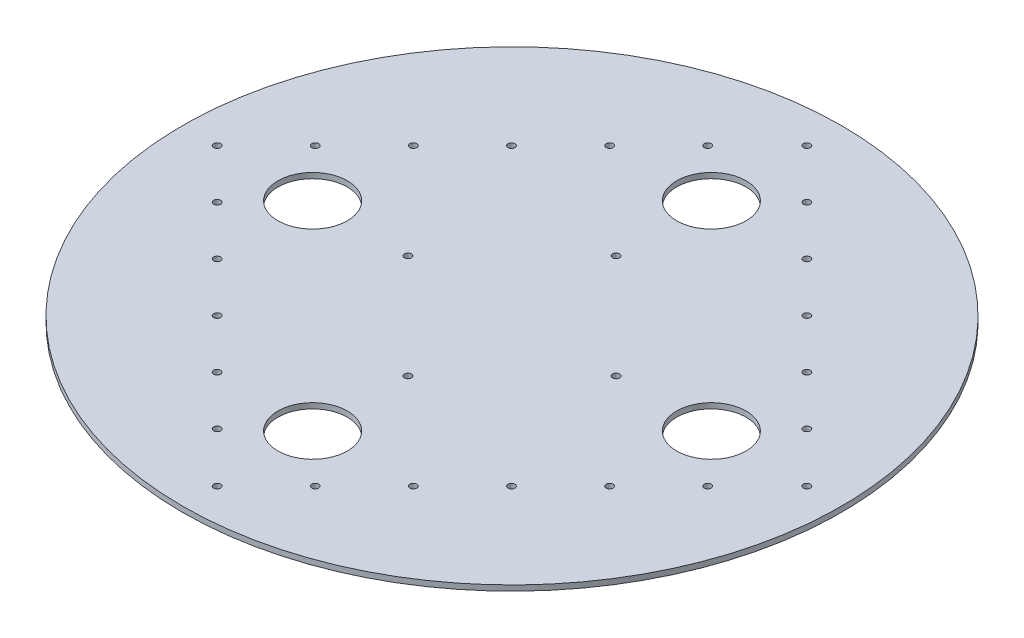
ISO-10303-21;
HEADER;
FILE_DESCRIPTION(('STEP AP214'),'2;1');
FILE_NAME('part.step','',(''),(''),'','','');
FILE_SCHEMA(('AUTOMOTIVE_DESIGN { 1 0 10303 214 1 1 1 1 }'));
ENDSEC;
DATA;
#1=APPLICATION_CONTEXT('core data for automotive mechanical design processes');
#2=APPLICATION_PROTOCOL_DEFINITION('international standard','automotive_design',2000,#1);
#3=PRODUCT_CONTEXT('',#1,'mechanical');
#4=PRODUCT('Part','Part','',(#3));
#5=PRODUCT_RELATED_PRODUCT_CATEGORY('part','',(#4));
#6=PRODUCT_DEFINITION_FORMATION('','',#4);
#7=PRODUCT_DEFINITION_CONTEXT('part definition',#1,'design');
#8=PRODUCT_DEFINITION('design','',#6,#7);
#9=PRODUCT_DEFINITION_SHAPE('','',#8);
#10=(LENGTH_UNIT() NAMED_UNIT(*) SI_UNIT(.MILLI.,.METRE.));
#11=(NAMED_UNIT(*) PLANE_ANGLE_UNIT() SI_UNIT($,.RADIAN.));
#12=(NAMED_UNIT(*) SI_UNIT($,.STERADIAN.) SOLID_ANGLE_UNIT());
#13=UNCERTAINTY_MEASURE_WITH_UNIT(LENGTH_MEASURE(1.E-05),#10,'distance_accuracy_value','');
#14=(GEOMETRIC_REPRESENTATION_CONTEXT(3) GLOBAL_UNCERTAINTY_ASSIGNED_CONTEXT((#13)) GLOBAL_UNIT_ASSIGNED_CONTEXT((#10,
#11,#12)) REPRESENTATION_CONTEXT('',''));
#15=CARTESIAN_POINT('',(0.,0.,0.));
#16=DIRECTION('',(0.,0.,1.));
#17=DIRECTION('',(1.,0.,0.));
#18=AXIS2_PLACEMENT_3D('',#15,#16,#17);
#19=CARTESIAN_POINT('',(0.,3.125,0.));
#20=DIRECTION('',(0.,1.,0.));
#21=DIRECTION('',(0.,0.,1.));
#22=AXIS2_PLACEMENT_3D('',#19,#20,#21);
#23=PLANE('',#22);
#24=CARTESIAN_POINT('',(-114.941299582184,3.125,0.));
#25=DIRECTION('',(0.,1.,0.));
#26=DIRECTION('',(0.,0.,1.));
#27=AXIS2_PLACEMENT_3D('',#24,#25,#26);
#28=CIRCLE('',#27,20.);
#29=CARTESIAN_POINT('',(-114.941299582184,3.125,20.));
#30=VERTEX_POINT('',#29);
#31=EDGE_CURVE('E297',#30,#30,#28,.T.);
#32=ORIENTED_EDGE('',*,*,#31,.F.);
#33=EDGE_LOOP('',(#32));
#34=FACE_BOUND('',#33,.T.);
#35=CARTESIAN_POINT('',(4.01315402553575E-13,3.125,-114.941299582184));
#36=DIRECTION('',(0.,1.,0.));
#37=DIRECTION('',(0.,0.,1.));
#38=AXIS2_PLACEMENT_3D('',#35,#36,#37);
#39=CIRCLE('',#38,20.);
#40=CARTESIAN_POINT('',(4.01315402553575E-13,3.125,-94.9412995821844));
#41=VERTEX_POINT('',#40);
#42=EDGE_CURVE('E289',#41,#41,#39,.T.);
#43=ORIENTED_EDGE('',*,*,#42,.F.);
#44=EDGE_LOOP('',(#43));
#45=FACE_BOUND('',#44,.T.);
#46=CARTESIAN_POINT('',(114.941299582184,3.125,8.0263080510715E-13));
#47=DIRECTION('',(0.,1.,0.));
#48=DIRECTION('',(0.,0.,1.));
#49=AXIS2_PLACEMENT_3D('',#46,#47,#48);
#50=CIRCLE('',#49,20.);
#51=CARTESIAN_POINT('',(114.941299582184,3.125,20.0000000000008));
#52=VERTEX_POINT('',#51);
#53=EDGE_CURVE('E280',#52,#52,#50,.T.);
#54=ORIENTED_EDGE('',*,*,#53,.F.);
#55=EDGE_LOOP('',(#54));
#56=FACE_BOUND('',#55,.T.);
#57=CARTESIAN_POINT('',(-1.20394620766072E-12,3.125,114.941299582184));
#58=DIRECTION('',(0.,1.,0.));
#59=DIRECTION('',(0.,0.,1.));
#60=AXIS2_PLACEMENT_3D('',#57,#58,#59);
#61=CIRCLE('',#60,20.);
#62=CARTESIAN_POINT('',(-1.20394620766072E-12,3.125,134.941299582184));
#63=VERTEX_POINT('',#62);
#64=EDGE_CURVE('E281',#63,#63,#61,.T.);
#65=ORIENTED_EDGE('',*,*,#64,.F.);
#66=EDGE_LOOP('',(#65));
#67=FACE_BOUND('',#66,.T.);
#68=CARTESIAN_POINT('',(-60.,3.125,0.));
#69=DIRECTION('',(0.,1.,0.));
#70=DIRECTION('',(0.,0.,1.));
#71=AXIS2_PLACEMENT_3D('',#68,#69,#70);
#72=CIRCLE('',#71,2.);
#73=CARTESIAN_POINT('',(-60.,3.125,2.));
#74=VERTEX_POINT('',#73);
#75=EDGE_CURVE('E266',#74,#74,#72,.T.);
#76=ORIENTED_EDGE('',*,*,#75,.F.);
#77=EDGE_LOOP('',(#76));
#78=FACE_BOUND('',#77,.T.);
#79=CARTESIAN_POINT('',(2.09488880330588E-13,3.125,-60.));
#80=DIRECTION('',(0.,1.,0.));
#81=DIRECTION('',(0.,0.,1.));
#82=AXIS2_PLACEMENT_3D('',#79,#80,#81);
#83=CIRCLE('',#82,2.);
#84=CARTESIAN_POINT('',(2.09488880330588E-13,3.125,-58.));
#85=VERTEX_POINT('',#84);
#86=EDGE_CURVE('E258',#85,#85,#83,.T.);
#87=ORIENTED_EDGE('',*,*,#86,.F.);
#88=EDGE_LOOP('',(#87));
#89=FACE_BOUND('',#88,.T.);
#90=CARTESIAN_POINT('',(60.,3.125,4.18977760661176E-13));
#91=DIRECTION('',(0.,1.,0.));
#92=DIRECTION('',(0.,0.,1.));
#93=AXIS2_PLACEMENT_3D('',#90,#91,#92);
#94=CIRCLE('',#93,2.00000000000001);
#95=CARTESIAN_POINT('',(60.,3.125,2.00000000000042));
#96=VERTEX_POINT('',#95);
#97=EDGE_CURVE('E248',#96,#96,#94,.T.);
#98=ORIENTED_EDGE('',*,*,#97,.F.);
#99=EDGE_LOOP('',(#98));
#100=FACE_BOUND('',#99,.T.);
#101=CARTESIAN_POINT('',(-6.28466640991764E-13,3.125,60.));
#102=DIRECTION('',(0.,1.,0.));
#103=DIRECTION('',(0.,0.,1.));
#104=AXIS2_PLACEMENT_3D('',#101,#102,#103);
#105=CIRCLE('',#104,2.);
#106=CARTESIAN_POINT('',(-6.28466640991764E-13,3.125,62.));
#107=VERTEX_POINT('',#106);
#108=EDGE_CURVE('E249',#107,#107,#105,.T.);
#109=ORIENTED_EDGE('',*,*,#108,.F.);
#110=EDGE_LOOP('',(#109));
#111=FACE_BOUND('',#110,.T.);
#112=CARTESIAN_POINT('',(113.137084989847,3.125,56.8629150101522));
#113=DIRECTION('',(0.,1.,0.));
#114=DIRECTION('',(0.,0.,1.));
#115=AXIS2_PLACEMENT_3D('',#112,#113,#114);
#116=CIRCLE('',#115,2.);
#117=CARTESIAN_POINT('',(113.137084989847,3.125,58.8629150101522));
#118=VERTEX_POINT('',#117);
#119=EDGE_CURVE('E224',#118,#118,#116,.T.);
#120=ORIENTED_EDGE('',*,*,#119,.F.);
#121=EDGE_LOOP('',(#120));
#122=FACE_BOUND('',#121,.T.);
#123=CARTESIAN_POINT('',(56.5685424949237,3.125,113.431457505076));
#124=DIRECTION('',(0.,1.,0.));
#125=DIRECTION('',(0.,0.,1.));
#126=AXIS2_PLACEMENT_3D('',#123,#124,#125);
#127=CIRCLE('',#126,2.);
#128=CARTESIAN_POINT('',(56.5685424949237,3.125,115.431457505076));
#129=VERTEX_POINT('',#128);
#130=EDGE_CURVE('E208',#129,#129,#127,.T.);
#131=ORIENTED_EDGE('',*,*,#130,.F.);
#132=EDGE_LOOP('',(#131));
#133=FACE_BOUND('',#132,.T.);
#134=CARTESIAN_POINT('',(141.421356237311,3.125,-28.5786437626922));
#135=DIRECTION('',(0.,1.,0.));
#136=DIRECTION('',(0.,0.,1.));
#137=AXIS2_PLACEMENT_3D('',#134,#135,#136);
#138=CIRCLE('',#137,2.);
#139=CARTESIAN_POINT('',(141.421356237311,3.125,-26.5786437626922));
#140=VERTEX_POINT('',#139);
#141=EDGE_CURVE('E192',#140,#140,#138,.T.);
#142=ORIENTED_EDGE('',*,*,#141,.F.);
#143=EDGE_LOOP('',(#142));
#144=FACE_BOUND('',#143,.T.);
#145=CARTESIAN_POINT('',(113.137084989849,3.125,-56.8629150101538));
#146=DIRECTION('',(0.,1.,0.));
#147=DIRECTION('',(0.,0.,1.));
#148=AXIS2_PLACEMENT_3D('',#145,#146,#147);
#149=CIRCLE('',#148,2.);
#150=CARTESIAN_POINT('',(113.137084989849,3.125,-54.8629150101538));
#151=VERTEX_POINT('',#150);
#152=EDGE_CURVE('E176',#151,#151,#149,.T.);
#153=ORIENTED_EDGE('',*,*,#152,.F.);
#154=EDGE_LOOP('',(#153));
#155=FACE_BOUND('',#154,.T.);
#156=CARTESIAN_POINT('',(84.8528137423868,3.125,-85.1471862576153));
#157=DIRECTION('',(0.,1.,0.));
#158=DIRECTION('',(0.,0.,1.));
#159=AXIS2_PLACEMENT_3D('',#156,#157,#158);
#160=CIRCLE('',#159,2.);
#161=CARTESIAN_POINT('',(84.8528137423868,3.125,-83.1471862576153));
#162=VERTEX_POINT('',#161);
#163=EDGE_CURVE('E160',#162,#162,#160,.T.);
#164=ORIENTED_EDGE('',*,*,#163,.F.);
#165=EDGE_LOOP('',(#164));
#166=FACE_BOUND('',#165,.T.);
#167=CARTESIAN_POINT('',(56.5685424949245,3.125,-113.431457505077));
#168=DIRECTION('',(0.,1.,0.));
#169=DIRECTION('',(0.,0.,1.));
#170=AXIS2_PLACEMENT_3D('',#167,#168,#169);
#171=CIRCLE('',#170,2.00000000000001);
#172=CARTESIAN_POINT('',(56.5685424949245,3.125,-111.431457505077));
#173=VERTEX_POINT('',#172);
#174=EDGE_CURVE('E144',#173,#173,#171,.T.);
#175=ORIENTED_EDGE('',*,*,#174,.F.);
#176=EDGE_LOOP('',(#175));
#177=FACE_BOUND('',#176,.T.);
#178=CARTESIAN_POINT('',(28.2842712474623,3.125,-141.715728752538));
#179=DIRECTION('',(0.,1.,0.));
#180=DIRECTION('',(0.,0.,1.));
#181=AXIS2_PLACEMENT_3D('',#178,#179,#180);
#182=CIRCLE('',#181,2.);
#183=CARTESIAN_POINT('',(28.2842712474623,3.125,-139.715728752538));
#184=VERTEX_POINT('',#183);
#185=EDGE_CURVE('E128',#184,#184,#182,.T.);
#186=ORIENTED_EDGE('',*,*,#185,.F.);
#187=EDGE_LOOP('',(#186));
#188=FACE_BOUND('',#187,.T.);
#189=CARTESIAN_POINT('',(-28.5786437626907,3.125,-141.42135623731));
#190=DIRECTION('',(0.,1.,0.));
#191=DIRECTION('',(0.,0.,1.));
#192=AXIS2_PLACEMENT_3D('',#189,#190,#191);
#193=CIRCLE('',#192,2.);
#194=CARTESIAN_POINT('',(-28.5786437626907,3.125,-139.42135623731));
#195=VERTEX_POINT('',#194);
#196=EDGE_CURVE('E112',#195,#195,#193,.T.);
#197=ORIENTED_EDGE('',*,*,#196,.F.);
#198=EDGE_LOOP('',(#197));
#199=FACE_BOUND('',#198,.T.);
#200=CARTESIAN_POINT('',(-85.1471862576144,3.125,-84.8528137423859));
#201=DIRECTION('',(0.,1.,0.));
#202=DIRECTION('',(0.,0.,1.));
#203=AXIS2_PLACEMENT_3D('',#200,#201,#202);
#204=CIRCLE('',#203,2.);
#205=CARTESIAN_POINT('',(-85.1471862576144,3.125,-82.8528137423859));
#206=VERTEX_POINT('',#205);
#207=EDGE_CURVE('E96',#206,#206,#204,.T.);
#208=ORIENTED_EDGE('',*,*,#207,.F.);
#209=EDGE_LOOP('',(#208));
#210=FACE_BOUND('',#209,.T.);
#211=CARTESIAN_POINT('',(-141.715728752538,3.125,-28.284271247462));
#212=DIRECTION('',(0.,1.,0.));
#213=DIRECTION('',(0.,0.,1.));
#214=AXIS2_PLACEMENT_3D('',#211,#212,#213);
#215=CIRCLE('',#214,2.);
#216=CARTESIAN_POINT('',(-141.715728752538,3.125,-26.284271247462));
#217=VERTEX_POINT('',#216);
#218=EDGE_CURVE('E80',#217,#217,#215,.T.);
#219=ORIENTED_EDGE('',*,*,#218,.F.);
#220=EDGE_LOOP('',(#219));
#221=FACE_BOUND('',#220,.T.);
#222=CARTESIAN_POINT('',(0.,3.125,-170.));
#223=DIRECTION('',(0.,1.,0.));
#224=DIRECTION('',(0.,0.,1.));
#225=AXIS2_PLACEMENT_3D('',#222,#223,#224);
#226=CIRCLE('',#225,2.00000000000001);
#227=CARTESIAN_POINT('',(0.,3.125,-168.));
#228=VERTEX_POINT('',#227);
#229=EDGE_CURVE('E64',#228,#228,#226,.T.);
#230=ORIENTED_EDGE('',*,*,#229,.F.);
#231=EDGE_LOOP('',(#230));
#232=FACE_BOUND('',#231,.T.);
#233=CARTESIAN_POINT('',(0.,3.125,170.));
#234=DIRECTION('',(0.,1.,0.));
#235=DIRECTION('',(0.,0.,1.));
#236=AXIS2_PLACEMENT_3D('',#233,#234,#235);
#237=CIRCLE('',#236,2.);
#238=CARTESIAN_POINT('',(0.,3.125,172.));
#239=VERTEX_POINT('',#238);
#240=EDGE_CURVE('E50',#239,#239,#237,.T.);
#241=ORIENTED_EDGE('',*,*,#240,.F.);
#242=EDGE_LOOP('',(#241));
#243=FACE_BOUND('',#242,.T.);
#244=CARTESIAN_POINT('',(0.,3.125,0.));
#245=DIRECTION('',(0.,1.,0.));
#246=DIRECTION('',(0.,0.,1.));
#247=AXIS2_PLACEMENT_3D('',#244,#245,#246);
#248=CIRCLE('',#247,190.);
#249=CARTESIAN_POINT('',(0.,3.125,190.));
#250=VERTEX_POINT('',#249);
#251=EDGE_CURVE('E10',#250,#250,#248,.T.);
#252=ORIENTED_EDGE('',*,*,#251,.T.);
#253=EDGE_LOOP('',(#252));
#254=FACE_BOUND('',#253,.T.);
#255=CARTESIAN_POINT('',(-170.,3.125,0.));
#256=DIRECTION('',(0.,1.,0.));
#257=DIRECTION('',(0.,0.,1.));
#258=AXIS2_PLACEMENT_3D('',#255,#256,#257);
#259=CIRCLE('',#258,2.);
#260=CARTESIAN_POINT('',(-170.,3.125,1.99999999999998));
#261=VERTEX_POINT('',#260);
#262=EDGE_CURVE('E56',#261,#261,#259,.T.);
#263=ORIENTED_EDGE('',*,*,#262,.F.);
#264=EDGE_LOOP('',(#263));
#265=FACE_BOUND('',#264,.T.);
#266=CARTESIAN_POINT('',(170.,3.125,0.));
#267=DIRECTION('',(0.,1.,0.));
#268=DIRECTION('',(0.,0.,1.));
#269=AXIS2_PLACEMENT_3D('',#266,#267,#268);
#270=CIRCLE('',#269,2.);
#271=CARTESIAN_POINT('',(170.,3.125,1.99999999999999));
#272=VERTEX_POINT('',#271);
#273=EDGE_CURVE('E72',#272,#272,#270,.T.);
#274=ORIENTED_EDGE('',*,*,#273,.F.);
#275=EDGE_LOOP('',(#274));
#276=FACE_BOUND('',#275,.T.);
#277=CARTESIAN_POINT('',(-113.431457505076,3.125,-56.5685424949239));
#278=DIRECTION('',(0.,1.,0.));
#279=DIRECTION('',(0.,0.,1.));
#280=AXIS2_PLACEMENT_3D('',#277,#278,#279);
#281=CIRCLE('',#280,2.);
#282=CARTESIAN_POINT('',(-113.431457505076,3.125,-54.5685424949239));
#283=VERTEX_POINT('',#282);
#284=EDGE_CURVE('E88',#283,#283,#281,.T.);
#285=ORIENTED_EDGE('',*,*,#284,.F.);
#286=EDGE_LOOP('',(#285));
#287=FACE_BOUND('',#286,.T.);
#288=CARTESIAN_POINT('',(-56.8629150101526,3.125,-113.137084989848));
#289=DIRECTION('',(0.,1.,0.));
#290=DIRECTION('',(0.,0.,1.));
#291=AXIS2_PLACEMENT_3D('',#288,#289,#290);
#292=CIRCLE('',#291,2.);
#293=CARTESIAN_POINT('',(-56.8629150101526,3.125,-111.137084989848));
#294=VERTEX_POINT('',#293);
#295=EDGE_CURVE('E104',#294,#294,#292,.T.);
#296=ORIENTED_EDGE('',*,*,#295,.F.);
#297=EDGE_LOOP('',(#296));
#298=FACE_BOUND('',#297,.T.);
#299=CARTESIAN_POINT('',(-141.715728752538,3.125,28.2842712474615));
#300=DIRECTION('',(0.,1.,0.));
#301=DIRECTION('',(0.,0.,1.));
#302=AXIS2_PLACEMENT_3D('',#299,#300,#301);
#303=CIRCLE('',#302,2.);
#304=CARTESIAN_POINT('',(-141.715728752538,3.125,30.2842712474615));
#305=VERTEX_POINT('',#304);
#306=EDGE_CURVE('E120',#305,#305,#303,.T.);
#307=ORIENTED_EDGE('',*,*,#306,.F.);
#308=EDGE_LOOP('',(#307));
#309=FACE_BOUND('',#308,.T.);
#310=CARTESIAN_POINT('',(-113.431457505075,3.125,56.5685424949231));
#311=DIRECTION('',(0.,1.,0.));
#312=DIRECTION('',(0.,0.,1.));
#313=AXIS2_PLACEMENT_3D('',#310,#311,#312);
#314=CIRCLE('',#313,2.);
#315=CARTESIAN_POINT('',(-113.431457505075,3.125,58.5685424949231));
#316=VERTEX_POINT('',#315);
#317=EDGE_CURVE('E136',#316,#316,#314,.T.);
#318=ORIENTED_EDGE('',*,*,#317,.F.);
#319=EDGE_LOOP('',(#318));
#320=FACE_BOUND('',#319,.T.);
#321=CARTESIAN_POINT('',(-85.1471862576132,3.125,84.8528137423847));
#322=DIRECTION('',(0.,1.,0.));
#323=DIRECTION('',(0.,0.,1.));
#324=AXIS2_PLACEMENT_3D('',#321,#322,#323);
#325=CIRCLE('',#324,2.);
#326=CARTESIAN_POINT('',(-85.1471862576132,3.125,86.8528137423847));
#327=VERTEX_POINT('',#326);
#328=EDGE_CURVE('E152',#327,#327,#325,.T.);
#329=ORIENTED_EDGE('',*,*,#328,.F.);
#330=EDGE_LOOP('',(#329));
#331=FACE_BOUND('',#330,.T.);
#332=CARTESIAN_POINT('',(-56.862915010151,3.125,113.137084989846));
#333=DIRECTION('',(0.,1.,0.));
#334=DIRECTION('',(0.,0.,1.));
#335=AXIS2_PLACEMENT_3D('',#332,#333,#334);
#336=CIRCLE('',#335,2.);
#337=CARTESIAN_POINT('',(-56.862915010151,3.125,115.137084989846));
#338=VERTEX_POINT('',#337);
#339=EDGE_CURVE('E168',#338,#338,#336,.T.);
#340=ORIENTED_EDGE('',*,*,#339,.F.);
#341=EDGE_LOOP('',(#340));
#342=FACE_BOUND('',#341,.T.);
#343=CARTESIAN_POINT('',(-28.5786437626887,3.125,141.421356237308));
#344=DIRECTION('',(0.,1.,0.));
#345=DIRECTION('',(0.,0.,1.));
#346=AXIS2_PLACEMENT_3D('',#343,#344,#345);
#347=CIRCLE('',#346,2.);
#348=CARTESIAN_POINT('',(-28.5786437626887,3.125,143.421356237308));
#349=VERTEX_POINT('',#348);
#350=EDGE_CURVE('E184',#349,#349,#347,.T.);
#351=ORIENTED_EDGE('',*,*,#350,.F.);
#352=EDGE_LOOP('',(#351));
#353=FACE_BOUND('',#352,.T.);
#354=CARTESIAN_POINT('',(28.2842712474619,3.125,141.715728752538));
#355=DIRECTION('',(0.,1.,0.));
#356=DIRECTION('',(0.,0.,1.));
#357=AXIS2_PLACEMENT_3D('',#354,#355,#356);
#358=CIRCLE('',#357,2.);
#359=CARTESIAN_POINT('',(28.2842712474619,3.125,143.715728752538));
#360=VERTEX_POINT('',#359);
#361=EDGE_CURVE('E200',#360,#360,#358,.T.);
#362=ORIENTED_EDGE('',*,*,#361,.F.);
#363=EDGE_LOOP('',(#362));
#364=FACE_BOUND('',#363,.T.);
#365=CARTESIAN_POINT('',(84.8528137423856,3.125,85.1471862576142));
#366=DIRECTION('',(0.,1.,0.));
#367=DIRECTION('',(0.,0.,1.));
#368=AXIS2_PLACEMENT_3D('',#365,#366,#367);
#369=CIRCLE('',#368,2.);
#370=CARTESIAN_POINT('',(84.8528137423856,3.125,87.1471862576142));
#371=VERTEX_POINT('',#370);
#372=EDGE_CURVE('E216',#371,#371,#369,.T.);
#373=ORIENTED_EDGE('',*,*,#372,.F.);
#374=EDGE_LOOP('',(#373));
#375=FACE_BOUND('',#374,.T.);
#376=CARTESIAN_POINT('',(141.421356237309,3.125,28.5786437626903));
#377=DIRECTION('',(0.,1.,0.));
#378=DIRECTION('',(0.,0.,1.));
#379=AXIS2_PLACEMENT_3D('',#376,#377,#378);
#380=CIRCLE('',#379,2.);
#381=CARTESIAN_POINT('',(141.421356237309,3.125,30.5786437626903));
#382=VERTEX_POINT('',#381);
#383=EDGE_CURVE('E232',#382,#382,#380,.T.);
#384=ORIENTED_EDGE('',*,*,#383,.F.);
#385=EDGE_LOOP('',(#384));
#386=FACE_BOUND('',#385,.T.);
#387=ADVANCED_FACE('F37',(#34,#45,#56,#67,#78,#89,#100,#111,#122,#133,#144,#155,#166,#177,#188,
#199,#210,#221,#232,#243,#254,#265,#276,#287,#298,#309,#320,#331,#342,#353,#364,#375,#386),#23,.T.);
#388=CARTESIAN_POINT('',(0.,0.,0.));
#389=DIRECTION('',(0.,1.,0.));
#390=DIRECTION('',(0.,0.,1.));
#391=AXIS2_PLACEMENT_3D('',#388,#389,#390);
#392=PLANE('',#391);
#393=CARTESIAN_POINT('',(-114.941299582184,0.,0.));
#394=DIRECTION('',(0.,1.,0.));
#395=DIRECTION('',(0.,0.,1.));
#396=AXIS2_PLACEMENT_3D('',#393,#394,#395);
#397=CIRCLE('',#396,20.);
#398=CARTESIAN_POINT('',(-114.941299582184,0.,20.));
#399=VERTEX_POINT('',#398);
#400=EDGE_CURVE('E253',#399,#399,#397,.F.);
#401=ORIENTED_EDGE('',*,*,#400,.F.);
#402=EDGE_LOOP('',(#401));
#403=FACE_BOUND('',#402,.T.);
#404=CARTESIAN_POINT('',(4.01315402553575E-13,0.,-114.941299582184));
#405=DIRECTION('',(0.,1.,0.));
#406=DIRECTION('',(0.,0.,1.));
#407=AXIS2_PLACEMENT_3D('',#404,#405,#406);
#408=CIRCLE('',#407,20.);
#409=CARTESIAN_POINT('',(4.01315402553575E-13,0.,-94.9412995821844));
#410=VERTEX_POINT('',#409);
#411=EDGE_CURVE('E293',#410,#410,#408,.F.);
#412=ORIENTED_EDGE('',*,*,#411,.F.);
#413=EDGE_LOOP('',(#412));
#414=FACE_BOUND('',#413,.T.);
#415=CARTESIAN_POINT('',(114.941299582184,0.,8.0263080510715E-13));
#416=DIRECTION('',(0.,1.,0.));
#417=DIRECTION('',(0.,0.,1.));
#418=AXIS2_PLACEMENT_3D('',#415,#416,#417);
#419=CIRCLE('',#418,20.);
#420=CARTESIAN_POINT('',(114.941299582184,0.,20.0000000000008));
#421=VERTEX_POINT('',#420);
#422=EDGE_CURVE('E285',#421,#421,#419,.F.);
#423=ORIENTED_EDGE('',*,*,#422,.F.);
#424=EDGE_LOOP('',(#423));
#425=FACE_BOUND('',#424,.T.);
#426=CARTESIAN_POINT('',(-1.20394620766072E-12,0.,114.941299582184));
#427=DIRECTION('',(0.,1.,0.));
#428=DIRECTION('',(0.,0.,1.));
#429=AXIS2_PLACEMENT_3D('',#426,#427,#428);
#430=CIRCLE('',#429,20.);
#431=CARTESIAN_POINT('',(-1.20394620766072E-12,0.,134.941299582184));
#432=VERTEX_POINT('',#431);
#433=EDGE_CURVE('E276',#432,#432,#430,.F.);
#434=ORIENTED_EDGE('',*,*,#433,.F.);
#435=EDGE_LOOP('',(#434));
#436=FACE_BOUND('',#435,.T.);
#437=CARTESIAN_POINT('',(-60.,0.,0.));
#438=DIRECTION('',(0.,1.,0.));
#439=DIRECTION('',(0.,0.,1.));
#440=AXIS2_PLACEMENT_3D('',#437,#438,#439);
#441=CIRCLE('',#440,2.);
#442=CARTESIAN_POINT('',(-60.,0.,2.));
#443=VERTEX_POINT('',#442);
#444=EDGE_CURVE('E240',#443,#443,#441,.F.);
#445=ORIENTED_EDGE('',*,*,#444,.F.);
#446=EDGE_LOOP('',(#445));
#447=FACE_BOUND('',#446,.T.);
#448=CARTESIAN_POINT('',(2.09488880330588E-13,0.,-60.));
#449=DIRECTION('',(0.,1.,0.));
#450=DIRECTION('',(0.,0.,1.));
#451=AXIS2_PLACEMENT_3D('',#448,#449,#450);
#452=CIRCLE('',#451,2.);
#453=CARTESIAN_POINT('',(2.09488880330588E-13,0.,-58.));
#454=VERTEX_POINT('',#453);
#455=EDGE_CURVE('E262',#454,#454,#452,.F.);
#456=ORIENTED_EDGE('',*,*,#455,.F.);
#457=EDGE_LOOP('',(#456));
#458=FACE_BOUND('',#457,.T.);
#459=CARTESIAN_POINT('',(60.,0.,4.18977760661176E-13));
#460=DIRECTION('',(0.,1.,0.));
#461=DIRECTION('',(0.,0.,1.));
#462=AXIS2_PLACEMENT_3D('',#459,#460,#461);
#463=CIRCLE('',#462,2.00000000000001);
#464=CARTESIAN_POINT('',(60.,0.,2.00000000000042));
#465=VERTEX_POINT('',#464);
#466=EDGE_CURVE('E254',#465,#465,#463,.F.);
#467=ORIENTED_EDGE('',*,*,#466,.F.);
#468=EDGE_LOOP('',(#467));
#469=FACE_BOUND('',#468,.T.);
#470=CARTESIAN_POINT('',(-6.28466640991764E-13,0.,60.));
#471=DIRECTION('',(0.,1.,0.));
#472=DIRECTION('',(0.,0.,1.));
#473=AXIS2_PLACEMENT_3D('',#470,#471,#472);
#474=CIRCLE('',#473,2.);
#475=CARTESIAN_POINT('',(-6.28466640991764E-13,0.,62.));
#476=VERTEX_POINT('',#475);
#477=EDGE_CURVE('E244',#476,#476,#474,.F.);
#478=ORIENTED_EDGE('',*,*,#477,.F.);
#479=EDGE_LOOP('',(#478));
#480=FACE_BOUND('',#479,.T.);
#481=CARTESIAN_POINT('',(0.,0.,0.));
#482=DIRECTION('',(0.,1.,0.));
#483=DIRECTION('',(0.,0.,1.));
#484=AXIS2_PLACEMENT_3D('',#481,#482,#483);
#485=CIRCLE('',#484,190.);
#486=CARTESIAN_POINT('',(0.,0.,190.));
#487=VERTEX_POINT('',#486);
#488=EDGE_CURVE('E41',#487,#487,#485,.T.);
#489=ORIENTED_EDGE('',*,*,#488,.F.);
#490=EDGE_LOOP('',(#489));
#491=FACE_BOUND('',#490,.T.);
#492=CARTESIAN_POINT('',(0.,0.,170.));
#493=DIRECTION('',(0.,1.,0.));
#494=DIRECTION('',(0.,0.,1.));
#495=AXIS2_PLACEMENT_3D('',#492,#493,#494);
#496=CIRCLE('',#495,2.);
#497=CARTESIAN_POINT('',(0.,0.,172.));
#498=VERTEX_POINT('',#497);
#499=EDGE_CURVE('E52',#498,#498,#496,.T.);
#500=ORIENTED_EDGE('',*,*,#499,.T.);
#501=EDGE_LOOP('',(#500));
#502=FACE_BOUND('',#501,.T.);
#503=CARTESIAN_POINT('',(-170.,0.,0.));
#504=DIRECTION('',(0.,1.,0.));
#505=DIRECTION('',(0.,0.,1.));
#506=AXIS2_PLACEMENT_3D('',#503,#504,#505);
#507=CIRCLE('',#506,2.);
#508=CARTESIAN_POINT('',(-170.,0.,1.99999999999998));
#509=VERTEX_POINT('',#508);
#510=EDGE_CURVE('E60',#509,#509,#507,.T.);
#511=ORIENTED_EDGE('',*,*,#510,.T.);
#512=EDGE_LOOP('',(#511));
#513=FACE_BOUND('',#512,.T.);
#514=CARTESIAN_POINT('',(0.,0.,-170.));
#515=DIRECTION('',(0.,1.,0.));
#516=DIRECTION('',(0.,0.,1.));
#517=AXIS2_PLACEMENT_3D('',#514,#515,#516);
#518=CIRCLE('',#517,2.00000000000001);
#519=CARTESIAN_POINT('',(0.,0.,-168.));
#520=VERTEX_POINT('',#519);
#521=EDGE_CURVE('E68',#520,#520,#518,.T.);
#522=ORIENTED_EDGE('',*,*,#521,.T.);
#523=EDGE_LOOP('',(#522));
#524=FACE_BOUND('',#523,.T.);
#525=CARTESIAN_POINT('',(170.,0.,0.));
#526=DIRECTION('',(0.,1.,0.));
#527=DIRECTION('',(0.,0.,1.));
#528=AXIS2_PLACEMENT_3D('',#525,#526,#527);
#529=CIRCLE('',#528,2.);
#530=CARTESIAN_POINT('',(170.,0.,1.99999999999999));
#531=VERTEX_POINT('',#530);
#532=EDGE_CURVE('E76',#531,#531,#529,.T.);
#533=ORIENTED_EDGE('',*,*,#532,.T.);
#534=EDGE_LOOP('',(#533));
#535=FACE_BOUND('',#534,.T.);
#536=CARTESIAN_POINT('',(-141.715728752538,0.,-28.284271247462));
#537=DIRECTION('',(0.,1.,0.));
#538=DIRECTION('',(0.,0.,1.));
#539=AXIS2_PLACEMENT_3D('',#536,#537,#538);
#540=CIRCLE('',#539,2.);
#541=CARTESIAN_POINT('',(-141.715728752538,0.,-26.284271247462));
#542=VERTEX_POINT('',#541);
#543=EDGE_CURVE('E84',#542,#542,#540,.T.);
#544=ORIENTED_EDGE('',*,*,#543,.T.);
#545=EDGE_LOOP('',(#544));
#546=FACE_BOUND('',#545,.T.);
#547=CARTESIAN_POINT('',(-113.431457505076,0.,-56.5685424949239));
#548=DIRECTION('',(0.,1.,0.));
#549=DIRECTION('',(0.,0.,1.));
#550=AXIS2_PLACEMENT_3D('',#547,#548,#549);
#551=CIRCLE('',#550,2.);
#552=CARTESIAN_POINT('',(-113.431457505076,0.,-54.5685424949239));
#553=VERTEX_POINT('',#552);
#554=EDGE_CURVE('E92',#553,#553,#551,.T.);
#555=ORIENTED_EDGE('',*,*,#554,.T.);
#556=EDGE_LOOP('',(#555));
#557=FACE_BOUND('',#556,.T.);
#558=CARTESIAN_POINT('',(-85.1471862576144,0.,-84.8528137423859));
#559=DIRECTION('',(0.,1.,0.));
#560=DIRECTION('',(0.,0.,1.));
#561=AXIS2_PLACEMENT_3D('',#558,#559,#560);
#562=CIRCLE('',#561,2.);
#563=CARTESIAN_POINT('',(-85.1471862576144,0.,-82.8528137423859));
#564=VERTEX_POINT('',#563);
#565=EDGE_CURVE('E100',#564,#564,#562,.T.);
#566=ORIENTED_EDGE('',*,*,#565,.T.);
#567=EDGE_LOOP('',(#566));
#568=FACE_BOUND('',#567,.T.);
#569=CARTESIAN_POINT('',(-56.8629150101526,0.,-113.137084989848));
#570=DIRECTION('',(0.,1.,0.));
#571=DIRECTION('',(0.,0.,1.));
#572=AXIS2_PLACEMENT_3D('',#569,#570,#571);
#573=CIRCLE('',#572,2.);
#574=CARTESIAN_POINT('',(-56.8629150101526,0.,-111.137084989848));
#575=VERTEX_POINT('',#574);
#576=EDGE_CURVE('E108',#575,#575,#573,.T.);
#577=ORIENTED_EDGE('',*,*,#576,.T.);
#578=EDGE_LOOP('',(#577));
#579=FACE_BOUND('',#578,.T.);
#580=CARTESIAN_POINT('',(-28.5786437626907,0.,-141.42135623731));
#581=DIRECTION('',(0.,1.,0.));
#582=DIRECTION('',(0.,0.,1.));
#583=AXIS2_PLACEMENT_3D('',#580,#581,#582);
#584=CIRCLE('',#583,2.);
#585=CARTESIAN_POINT('',(-28.5786437626907,0.,-139.42135623731));
#586=VERTEX_POINT('',#585);
#587=EDGE_CURVE('E116',#586,#586,#584,.T.);
#588=ORIENTED_EDGE('',*,*,#587,.T.);
#589=EDGE_LOOP('',(#588));
#590=FACE_BOUND('',#589,.T.);
#591=CARTESIAN_POINT('',(-141.715728752538,0.,28.2842712474615));
#592=DIRECTION('',(0.,1.,0.));
#593=DIRECTION('',(0.,0.,1.));
#594=AXIS2_PLACEMENT_3D('',#591,#592,#593);
#595=CIRCLE('',#594,2.);
#596=CARTESIAN_POINT('',(-141.715728752538,0.,30.2842712474615));
#597=VERTEX_POINT('',#596);
#598=EDGE_CURVE('E124',#597,#597,#595,.T.);
#599=ORIENTED_EDGE('',*,*,#598,.T.);
#600=EDGE_LOOP('',(#599));
#601=FACE_BOUND('',#600,.T.);
#602=CARTESIAN_POINT('',(28.2842712474623,0.,-141.715728752538));
#603=DIRECTION('',(0.,1.,0.));
#604=DIRECTION('',(0.,0.,1.));
#605=AXIS2_PLACEMENT_3D('',#602,#603,#604);
#606=CIRCLE('',#605,2.);
#607=CARTESIAN_POINT('',(28.2842712474623,0.,-139.715728752538));
#608=VERTEX_POINT('',#607);
#609=EDGE_CURVE('E132',#608,#608,#606,.T.);
#610=ORIENTED_EDGE('',*,*,#609,.T.);
#611=EDGE_LOOP('',(#610));
#612=FACE_BOUND('',#611,.T.);
#613=CARTESIAN_POINT('',(-113.431457505075,0.,56.5685424949231));
#614=DIRECTION('',(0.,1.,0.));
#615=DIRECTION('',(0.,0.,1.));
#616=AXIS2_PLACEMENT_3D('',#613,#614,#615);
#617=CIRCLE('',#616,2.);
#618=CARTESIAN_POINT('',(-113.431457505075,0.,58.5685424949231));
#619=VERTEX_POINT('',#618);
#620=EDGE_CURVE('E140',#619,#619,#617,.T.);
#621=ORIENTED_EDGE('',*,*,#620,.T.);
#622=EDGE_LOOP('',(#621));
#623=FACE_BOUND('',#622,.T.);
#624=CARTESIAN_POINT('',(56.5685424949245,0.,-113.431457505077));
#625=DIRECTION('',(0.,1.,0.));
#626=DIRECTION('',(0.,0.,1.));
#627=AXIS2_PLACEMENT_3D('',#624,#625,#626);
#628=CIRCLE('',#627,2.00000000000001);
#629=CARTESIAN_POINT('',(56.5685424949245,0.,-111.431457505077));
#630=VERTEX_POINT('',#629);
#631=EDGE_CURVE('E148',#630,#630,#628,.T.);
#632=ORIENTED_EDGE('',*,*,#631,.T.);
#633=EDGE_LOOP('',(#632));
#634=FACE_BOUND('',#633,.T.);
#635=CARTESIAN_POINT('',(-85.1471862576132,0.,84.8528137423847));
#636=DIRECTION('',(0.,1.,0.));
#637=DIRECTION('',(0.,0.,1.));
#638=AXIS2_PLACEMENT_3D('',#635,#636,#637);
#639=CIRCLE('',#638,2.);
#640=CARTESIAN_POINT('',(-85.1471862576132,0.,86.8528137423847));
#641=VERTEX_POINT('',#640);
#642=EDGE_CURVE('E156',#641,#641,#639,.T.);
#643=ORIENTED_EDGE('',*,*,#642,.T.);
#644=EDGE_LOOP('',(#643));
#645=FACE_BOUND('',#644,.T.);
#646=CARTESIAN_POINT('',(84.8528137423868,0.,-85.1471862576153));
#647=DIRECTION('',(0.,1.,0.));
#648=DIRECTION('',(0.,0.,1.));
#649=AXIS2_PLACEMENT_3D('',#646,#647,#648);
#650=CIRCLE('',#649,2.);
#651=CARTESIAN_POINT('',(84.8528137423868,0.,-83.1471862576153));
#652=VERTEX_POINT('',#651);
#653=EDGE_CURVE('E164',#652,#652,#650,.T.);
#654=ORIENTED_EDGE('',*,*,#653,.T.);
#655=EDGE_LOOP('',(#654));
#656=FACE_BOUND('',#655,.T.);
#657=CARTESIAN_POINT('',(-56.862915010151,0.,113.137084989846));
#658=DIRECTION('',(0.,1.,0.));
#659=DIRECTION('',(0.,0.,1.));
#660=AXIS2_PLACEMENT_3D('',#657,#658,#659);
#661=CIRCLE('',#660,2.);
#662=CARTESIAN_POINT('',(-56.862915010151,0.,115.137084989846));
#663=VERTEX_POINT('',#662);
#664=EDGE_CURVE('E172',#663,#663,#661,.T.);
#665=ORIENTED_EDGE('',*,*,#664,.T.);
#666=EDGE_LOOP('',(#665));
#667=FACE_BOUND('',#666,.T.);
#668=CARTESIAN_POINT('',(113.137084989849,0.,-56.8629150101538));
#669=DIRECTION('',(0.,1.,0.));
#670=DIRECTION('',(0.,0.,1.));
#671=AXIS2_PLACEMENT_3D('',#668,#669,#670);
#672=CIRCLE('',#671,2.);
#673=CARTESIAN_POINT('',(113.137084989849,0.,-54.8629150101538));
#674=VERTEX_POINT('',#673);
#675=EDGE_CURVE('E180',#674,#674,#672,.T.);
#676=ORIENTED_EDGE('',*,*,#675,.T.);
#677=EDGE_LOOP('',(#676));
#678=FACE_BOUND('',#677,.T.);
#679=CARTESIAN_POINT('',(-28.5786437626887,0.,141.421356237308));
#680=DIRECTION('',(0.,1.,0.));
#681=DIRECTION('',(0.,0.,1.));
#682=AXIS2_PLACEMENT_3D('',#679,#680,#681);
#683=CIRCLE('',#682,2.);
#684=CARTESIAN_POINT('',(-28.5786437626887,0.,143.421356237308));
#685=VERTEX_POINT('',#684);
#686=EDGE_CURVE('E188',#685,#685,#683,.T.);
#687=ORIENTED_EDGE('',*,*,#686,.T.);
#688=EDGE_LOOP('',(#687));
#689=FACE_BOUND('',#688,.T.);
#690=CARTESIAN_POINT('',(141.421356237311,0.,-28.5786437626922));
#691=DIRECTION('',(0.,1.,0.));
#692=DIRECTION('',(0.,0.,1.));
#693=AXIS2_PLACEMENT_3D('',#690,#691,#692);
#694=CIRCLE('',#693,2.);
#695=CARTESIAN_POINT('',(141.421356237311,0.,-26.5786437626922));
#696=VERTEX_POINT('',#695);
#697=EDGE_CURVE('E196',#696,#696,#694,.T.);
#698=ORIENTED_EDGE('',*,*,#697,.T.);
#699=EDGE_LOOP('',(#698));
#700=FACE_BOUND('',#699,.T.);
#701=CARTESIAN_POINT('',(28.2842712474619,0.,141.715728752538));
#702=DIRECTION('',(0.,1.,0.));
#703=DIRECTION('',(0.,0.,1.));
#704=AXIS2_PLACEMENT_3D('',#701,#702,#703);
#705=CIRCLE('',#704,2.);
#706=CARTESIAN_POINT('',(28.2842712474619,0.,143.715728752538));
#707=VERTEX_POINT('',#706);
#708=EDGE_CURVE('E204',#707,#707,#705,.T.);
#709=ORIENTED_EDGE('',*,*,#708,.T.);
#710=EDGE_LOOP('',(#709));
#711=FACE_BOUND('',#710,.T.);
#712=CARTESIAN_POINT('',(56.5685424949237,0.,113.431457505076));
#713=DIRECTION('',(0.,1.,0.));
#714=DIRECTION('',(0.,0.,1.));
#715=AXIS2_PLACEMENT_3D('',#712,#713,#714);
#716=CIRCLE('',#715,2.);
#717=CARTESIAN_POINT('',(56.5685424949237,0.,115.431457505076));
#718=VERTEX_POINT('',#717);
#719=EDGE_CURVE('E212',#718,#718,#716,.T.);
#720=ORIENTED_EDGE('',*,*,#719,.T.);
#721=EDGE_LOOP('',(#720));
#722=FACE_BOUND('',#721,.T.);
#723=CARTESIAN_POINT('',(84.8528137423856,0.,85.1471862576142));
#724=DIRECTION('',(0.,1.,0.));
#725=DIRECTION('',(0.,0.,1.));
#726=AXIS2_PLACEMENT_3D('',#723,#724,#725);
#727=CIRCLE('',#726,2.);
#728=CARTESIAN_POINT('',(84.8528137423856,0.,87.1471862576142));
#729=VERTEX_POINT('',#728);
#730=EDGE_CURVE('E220',#729,#729,#727,.T.);
#731=ORIENTED_EDGE('',*,*,#730,.T.);
#732=EDGE_LOOP('',(#731));
#733=FACE_BOUND('',#732,.T.);
#734=CARTESIAN_POINT('',(113.137084989847,0.,56.8629150101522));
#735=DIRECTION('',(0.,1.,0.));
#736=DIRECTION('',(0.,0.,1.));
#737=AXIS2_PLACEMENT_3D('',#734,#735,#736);
#738=CIRCLE('',#737,2.);
#739=CARTESIAN_POINT('',(113.137084989847,0.,58.8629150101522));
#740=VERTEX_POINT('',#739);
#741=EDGE_CURVE('E228',#740,#740,#738,.T.);
#742=ORIENTED_EDGE('',*,*,#741,.T.);
#743=EDGE_LOOP('',(#742));
#744=FACE_BOUND('',#743,.T.);
#745=CARTESIAN_POINT('',(141.421356237309,0.,28.5786437626903));
#746=DIRECTION('',(0.,1.,0.));
#747=DIRECTION('',(0.,0.,1.));
#748=AXIS2_PLACEMENT_3D('',#745,#746,#747);
#749=CIRCLE('',#748,2.);
#750=CARTESIAN_POINT('',(141.421356237309,0.,30.5786437626903));
#751=VERTEX_POINT('',#750);
#752=EDGE_CURVE('E236',#751,#751,#749,.T.);
#753=ORIENTED_EDGE('',*,*,#752,.T.);
#754=EDGE_LOOP('',(#753));
#755=FACE_BOUND('',#754,.T.);
#756=ADVANCED_FACE('F312',(#403,#414,#425,#436,#447,#458,#469,#480,#491,#502,#513,#524,#535,
#546,#557,#568,#579,#590,#601,#612,#623,#634,#645,#656,#667,#678,#689,#700,#711,#722,#733,#744,
#755),#392,.F.);
#757=CARTESIAN_POINT('',(0.,3.125,0.));
#758=DIRECTION('',(0.,-1.,0.));
#759=DIRECTION('',(0.,0.,-1.));
#760=AXIS2_PLACEMENT_3D('',#757,#758,#759);
#761=CYLINDRICAL_SURFACE('',#760,190.);
#762=ORIENTED_EDGE('',*,*,#251,.F.);
#763=EDGE_LOOP('',(#762));
#764=FACE_BOUND('',#763,.T.);
#765=ORIENTED_EDGE('',*,*,#488,.T.);
#766=EDGE_LOOP('',(#765));
#767=FACE_BOUND('',#766,.T.);
#768=ADVANCED_FACE('F39',(#764,#767),#761,.T.);
#769=CARTESIAN_POINT('',(0.,3.125,170.));
#770=DIRECTION('',(0.,-1.,0.));
#771=DIRECTION('',(0.,0.,-1.));
#772=AXIS2_PLACEMENT_3D('',#769,#770,#771);
#773=CYLINDRICAL_SURFACE('',#772,2.);
#774=ORIENTED_EDGE('',*,*,#240,.T.);
#775=EDGE_LOOP('',(#774));
#776=FACE_BOUND('',#775,.T.);
#777=ORIENTED_EDGE('',*,*,#499,.F.);
#778=EDGE_LOOP('',(#777));
#779=FACE_BOUND('',#778,.T.);
#780=ADVANCED_FACE('F389',(#776,#779),#773,.F.);
#781=CARTESIAN_POINT('',(-170.,3.125,0.));
#782=DIRECTION('',(0.,-1.,0.));
#783=DIRECTION('',(0.,0.,-1.));
#784=AXIS2_PLACEMENT_3D('',#781,#782,#783);
#785=CYLINDRICAL_SURFACE('',#784,2.);
#786=ORIENTED_EDGE('',*,*,#262,.T.);
#787=EDGE_LOOP('',(#786));
#788=FACE_BOUND('',#787,.T.);
#789=ORIENTED_EDGE('',*,*,#510,.F.);
#790=EDGE_LOOP('',(#789));
#791=FACE_BOUND('',#790,.T.);
#792=ADVANCED_FACE('F396',(#788,#791),#785,.F.);
#793=CARTESIAN_POINT('',(0.,3.125,-170.));
#794=DIRECTION('',(0.,-1.,0.));
#795=DIRECTION('',(0.,0.,-1.));
#796=AXIS2_PLACEMENT_3D('',#793,#794,#795);
#797=CYLINDRICAL_SURFACE('',#796,2.00000000000001);
#798=ORIENTED_EDGE('',*,*,#229,.T.);
#799=EDGE_LOOP('',(#798));
#800=FACE_BOUND('',#799,.T.);
#801=ORIENTED_EDGE('',*,*,#521,.F.);
#802=EDGE_LOOP('',(#801));
#803=FACE_BOUND('',#802,.T.);
#804=ADVANCED_FACE('F400',(#800,#803),#797,.F.);
#805=CARTESIAN_POINT('',(170.,3.125,0.));
#806=DIRECTION('',(0.,-1.,0.));
#807=DIRECTION('',(0.,0.,-1.));
#808=AXIS2_PLACEMENT_3D('',#805,#806,#807);
#809=CYLINDRICAL_SURFACE('',#808,2.);
#810=ORIENTED_EDGE('',*,*,#273,.T.);
#811=EDGE_LOOP('',(#810));
#812=FACE_BOUND('',#811,.T.);
#813=ORIENTED_EDGE('',*,*,#532,.F.);
#814=EDGE_LOOP('',(#813));
#815=FACE_BOUND('',#814,.T.);
#816=ADVANCED_FACE('F404',(#812,#815),#809,.F.);
#817=CARTESIAN_POINT('',(-141.715728752538,3.125,-28.284271247462));
#818=DIRECTION('',(0.,-1.,0.));
#819=DIRECTION('',(0.,0.,-1.));
#820=AXIS2_PLACEMENT_3D('',#817,#818,#819);
#821=CYLINDRICAL_SURFACE('',#820,2.);
#822=ORIENTED_EDGE('',*,*,#218,.T.);
#823=EDGE_LOOP('',(#822));
#824=FACE_BOUND('',#823,.T.);
#825=ORIENTED_EDGE('',*,*,#543,.F.);
#826=EDGE_LOOP('',(#825));
#827=FACE_BOUND('',#826,.T.);
#828=ADVANCED_FACE('F408',(#824,#827),#821,.F.);
#829=CARTESIAN_POINT('',(-113.431457505076,3.125,-56.5685424949239));
#830=DIRECTION('',(0.,-1.,0.));
#831=DIRECTION('',(0.,0.,-1.));
#832=AXIS2_PLACEMENT_3D('',#829,#830,#831);
#833=CYLINDRICAL_SURFACE('',#832,2.);
#834=ORIENTED_EDGE('',*,*,#284,.T.);
#835=EDGE_LOOP('',(#834));
#836=FACE_BOUND('',#835,.T.);
#837=ORIENTED_EDGE('',*,*,#554,.F.);
#838=EDGE_LOOP('',(#837));
#839=FACE_BOUND('',#838,.T.);
#840=ADVANCED_FACE('F412',(#836,#839),#833,.F.);
#841=CARTESIAN_POINT('',(-85.1471862576144,3.125,-84.8528137423859));
#842=DIRECTION('',(0.,-1.,0.));
#843=DIRECTION('',(0.,0.,-1.));
#844=AXIS2_PLACEMENT_3D('',#841,#842,#843);
#845=CYLINDRICAL_SURFACE('',#844,2.);
#846=ORIENTED_EDGE('',*,*,#207,.T.);
#847=EDGE_LOOP('',(#846));
#848=FACE_BOUND('',#847,.T.);
#849=ORIENTED_EDGE('',*,*,#565,.F.);
#850=EDGE_LOOP('',(#849));
#851=FACE_BOUND('',#850,.T.);
#852=ADVANCED_FACE('F416',(#848,#851),#845,.F.);
#853=CARTESIAN_POINT('',(-56.8629150101526,3.125,-113.137084989848));
#854=DIRECTION('',(0.,-1.,0.));
#855=DIRECTION('',(0.,0.,-1.));
#856=AXIS2_PLACEMENT_3D('',#853,#854,#855);
#857=CYLINDRICAL_SURFACE('',#856,2.);
#858=ORIENTED_EDGE('',*,*,#295,.T.);
#859=EDGE_LOOP('',(#858));
#860=FACE_BOUND('',#859,.T.);
#861=ORIENTED_EDGE('',*,*,#576,.F.);
#862=EDGE_LOOP('',(#861));
#863=FACE_BOUND('',#862,.T.);
#864=ADVANCED_FACE('F420',(#860,#863),#857,.F.);
#865=CARTESIAN_POINT('',(-28.5786437626907,3.125,-141.42135623731));
#866=DIRECTION('',(0.,-1.,0.));
#867=DIRECTION('',(0.,0.,-1.));
#868=AXIS2_PLACEMENT_3D('',#865,#866,#867);
#869=CYLINDRICAL_SURFACE('',#868,2.);
#870=ORIENTED_EDGE('',*,*,#196,.T.);
#871=EDGE_LOOP('',(#870));
#872=FACE_BOUND('',#871,.T.);
#873=ORIENTED_EDGE('',*,*,#587,.F.);
#874=EDGE_LOOP('',(#873));
#875=FACE_BOUND('',#874,.T.);
#876=ADVANCED_FACE('F424',(#872,#875),#869,.F.);
#877=CARTESIAN_POINT('',(-141.715728752538,3.125,28.2842712474615));
#878=DIRECTION('',(0.,-1.,0.));
#879=DIRECTION('',(0.,0.,-1.));
#880=AXIS2_PLACEMENT_3D('',#877,#878,#879);
#881=CYLINDRICAL_SURFACE('',#880,2.);
#882=ORIENTED_EDGE('',*,*,#306,.T.);
#883=EDGE_LOOP('',(#882));
#884=FACE_BOUND('',#883,.T.);
#885=ORIENTED_EDGE('',*,*,#598,.F.);
#886=EDGE_LOOP('',(#885));
#887=FACE_BOUND('',#886,.T.);
#888=ADVANCED_FACE('F428',(#884,#887),#881,.F.);
#889=CARTESIAN_POINT('',(28.2842712474623,3.125,-141.715728752538));
#890=DIRECTION('',(0.,-1.,0.));
#891=DIRECTION('',(0.,0.,-1.));
#892=AXIS2_PLACEMENT_3D('',#889,#890,#891);
#893=CYLINDRICAL_SURFACE('',#892,2.);
#894=ORIENTED_EDGE('',*,*,#185,.T.);
#895=EDGE_LOOP('',(#894));
#896=FACE_BOUND('',#895,.T.);
#897=ORIENTED_EDGE('',*,*,#609,.F.);
#898=EDGE_LOOP('',(#897));
#899=FACE_BOUND('',#898,.T.);
#900=ADVANCED_FACE('F432',(#896,#899),#893,.F.);
#901=CARTESIAN_POINT('',(-113.431457505075,3.125,56.5685424949231));
#902=DIRECTION('',(0.,-1.,0.));
#903=DIRECTION('',(0.,0.,-1.));
#904=AXIS2_PLACEMENT_3D('',#901,#902,#903);
#905=CYLINDRICAL_SURFACE('',#904,2.);
#906=ORIENTED_EDGE('',*,*,#317,.T.);
#907=EDGE_LOOP('',(#906));
#908=FACE_BOUND('',#907,.T.);
#909=ORIENTED_EDGE('',*,*,#620,.F.);
#910=EDGE_LOOP('',(#909));
#911=FACE_BOUND('',#910,.T.);
#912=ADVANCED_FACE('F436',(#908,#911),#905,.F.);
#913=CARTESIAN_POINT('',(56.5685424949245,3.125,-113.431457505077));
#914=DIRECTION('',(0.,-1.,0.));
#915=DIRECTION('',(0.,0.,-1.));
#916=AXIS2_PLACEMENT_3D('',#913,#914,#915);
#917=CYLINDRICAL_SURFACE('',#916,2.00000000000001);
#918=ORIENTED_EDGE('',*,*,#174,.T.);
#919=EDGE_LOOP('',(#918));
#920=FACE_BOUND('',#919,.T.);
#921=ORIENTED_EDGE('',*,*,#631,.F.);
#922=EDGE_LOOP('',(#921));
#923=FACE_BOUND('',#922,.T.);
#924=ADVANCED_FACE('F440',(#920,#923),#917,.F.);
#925=CARTESIAN_POINT('',(-85.1471862576132,3.125,84.8528137423847));
#926=DIRECTION('',(0.,-1.,0.));
#927=DIRECTION('',(0.,0.,-1.));
#928=AXIS2_PLACEMENT_3D('',#925,#926,#927);
#929=CYLINDRICAL_SURFACE('',#928,2.);
#930=ORIENTED_EDGE('',*,*,#328,.T.);
#931=EDGE_LOOP('',(#930));
#932=FACE_BOUND('',#931,.T.);
#933=ORIENTED_EDGE('',*,*,#642,.F.);
#934=EDGE_LOOP('',(#933));
#935=FACE_BOUND('',#934,.T.);
#936=ADVANCED_FACE('F444',(#932,#935),#929,.F.);
#937=CARTESIAN_POINT('',(84.8528137423868,3.125,-85.1471862576153));
#938=DIRECTION('',(0.,-1.,0.));
#939=DIRECTION('',(0.,0.,-1.));
#940=AXIS2_PLACEMENT_3D('',#937,#938,#939);
#941=CYLINDRICAL_SURFACE('',#940,2.);
#942=ORIENTED_EDGE('',*,*,#163,.T.);
#943=EDGE_LOOP('',(#942));
#944=FACE_BOUND('',#943,.T.);
#945=ORIENTED_EDGE('',*,*,#653,.F.);
#946=EDGE_LOOP('',(#945));
#947=FACE_BOUND('',#946,.T.);
#948=ADVANCED_FACE('F448',(#944,#947),#941,.F.);
#949=CARTESIAN_POINT('',(-56.862915010151,3.125,113.137084989846));
#950=DIRECTION('',(0.,-1.,0.));
#951=DIRECTION('',(0.,0.,-1.));
#952=AXIS2_PLACEMENT_3D('',#949,#950,#951);
#953=CYLINDRICAL_SURFACE('',#952,2.);
#954=ORIENTED_EDGE('',*,*,#339,.T.);
#955=EDGE_LOOP('',(#954));
#956=FACE_BOUND('',#955,.T.);
#957=ORIENTED_EDGE('',*,*,#664,.F.);
#958=EDGE_LOOP('',(#957));
#959=FACE_BOUND('',#958,.T.);
#960=ADVANCED_FACE('F452',(#956,#959),#953,.F.);
#961=CARTESIAN_POINT('',(113.137084989849,3.125,-56.8629150101538));
#962=DIRECTION('',(0.,-1.,0.));
#963=DIRECTION('',(0.,0.,-1.));
#964=AXIS2_PLACEMENT_3D('',#961,#962,#963);
#965=CYLINDRICAL_SURFACE('',#964,2.);
#966=ORIENTED_EDGE('',*,*,#152,.T.);
#967=EDGE_LOOP('',(#966));
#968=FACE_BOUND('',#967,.T.);
#969=ORIENTED_EDGE('',*,*,#675,.F.);
#970=EDGE_LOOP('',(#969));
#971=FACE_BOUND('',#970,.T.);
#972=ADVANCED_FACE('F456',(#968,#971),#965,.F.);
#973=CARTESIAN_POINT('',(-28.5786437626887,3.125,141.421356237308));
#974=DIRECTION('',(0.,-1.,0.));
#975=DIRECTION('',(0.,0.,-1.));
#976=AXIS2_PLACEMENT_3D('',#973,#974,#975);
#977=CYLINDRICAL_SURFACE('',#976,2.);
#978=ORIENTED_EDGE('',*,*,#350,.T.);
#979=EDGE_LOOP('',(#978));
#980=FACE_BOUND('',#979,.T.);
#981=ORIENTED_EDGE('',*,*,#686,.F.);
#982=EDGE_LOOP('',(#981));
#983=FACE_BOUND('',#982,.T.);
#984=ADVANCED_FACE('F460',(#980,#983),#977,.F.);
#985=CARTESIAN_POINT('',(141.421356237311,3.125,-28.5786437626922));
#986=DIRECTION('',(0.,-1.,0.));
#987=DIRECTION('',(0.,0.,-1.));
#988=AXIS2_PLACEMENT_3D('',#985,#986,#987);
#989=CYLINDRICAL_SURFACE('',#988,2.);
#990=ORIENTED_EDGE('',*,*,#141,.T.);
#991=EDGE_LOOP('',(#990));
#992=FACE_BOUND('',#991,.T.);
#993=ORIENTED_EDGE('',*,*,#697,.F.);
#994=EDGE_LOOP('',(#993));
#995=FACE_BOUND('',#994,.T.);
#996=ADVANCED_FACE('F464',(#992,#995),#989,.F.);
#997=CARTESIAN_POINT('',(28.2842712474619,3.125,141.715728752538));
#998=DIRECTION('',(0.,-1.,0.));
#999=DIRECTION('',(0.,0.,-1.));
#1000=AXIS2_PLACEMENT_3D('',#997,#998,#999);
#1001=CYLINDRICAL_SURFACE('',#1000,2.);
#1002=ORIENTED_EDGE('',*,*,#361,.T.);
#1003=EDGE_LOOP('',(#1002));
#1004=FACE_BOUND('',#1003,.T.);
#1005=ORIENTED_EDGE('',*,*,#708,.F.);
#1006=EDGE_LOOP('',(#1005));
#1007=FACE_BOUND('',#1006,.T.);
#1008=ADVANCED_FACE('F468',(#1004,#1007),#1001,.F.);
#1009=CARTESIAN_POINT('',(56.5685424949237,3.125,113.431457505076));
#1010=DIRECTION('',(0.,-1.,0.));
#1011=DIRECTION('',(0.,0.,-1.));
#1012=AXIS2_PLACEMENT_3D('',#1009,#1010,#1011);
#1013=CYLINDRICAL_SURFACE('',#1012,2.);
#1014=ORIENTED_EDGE('',*,*,#130,.T.);
#1015=EDGE_LOOP('',(#1014));
#1016=FACE_BOUND('',#1015,.T.);
#1017=ORIENTED_EDGE('',*,*,#719,.F.);
#1018=EDGE_LOOP('',(#1017));
#1019=FACE_BOUND('',#1018,.T.);
#1020=ADVANCED_FACE('F472',(#1016,#1019),#1013,.F.);
#1021=CARTESIAN_POINT('',(84.8528137423856,3.125,85.1471862576142));
#1022=DIRECTION('',(0.,-1.,0.));
#1023=DIRECTION('',(0.,0.,-1.));
#1024=AXIS2_PLACEMENT_3D('',#1021,#1022,#1023);
#1025=CYLINDRICAL_SURFACE('',#1024,2.);
#1026=ORIENTED_EDGE('',*,*,#372,.T.);
#1027=EDGE_LOOP('',(#1026));
#1028=FACE_BOUND('',#1027,.T.);
#1029=ORIENTED_EDGE('',*,*,#730,.F.);
#1030=EDGE_LOOP('',(#1029));
#1031=FACE_BOUND('',#1030,.T.);
#1032=ADVANCED_FACE('F476',(#1028,#1031),#1025,.F.);
#1033=CARTESIAN_POINT('',(113.137084989847,3.125,56.8629150101522));
#1034=DIRECTION('',(0.,-1.,0.));
#1035=DIRECTION('',(0.,0.,-1.));
#1036=AXIS2_PLACEMENT_3D('',#1033,#1034,#1035);
#1037=CYLINDRICAL_SURFACE('',#1036,2.);
#1038=ORIENTED_EDGE('',*,*,#119,.T.);
#1039=EDGE_LOOP('',(#1038));
#1040=FACE_BOUND('',#1039,.T.);
#1041=ORIENTED_EDGE('',*,*,#741,.F.);
#1042=EDGE_LOOP('',(#1041));
#1043=FACE_BOUND('',#1042,.T.);
#1044=ADVANCED_FACE('F380',(#1040,#1043),#1037,.F.);
#1045=CARTESIAN_POINT('',(141.421356237309,3.125,28.5786437626903));
#1046=DIRECTION('',(0.,-1.,0.));
#1047=DIRECTION('',(0.,0.,-1.));
#1048=AXIS2_PLACEMENT_3D('',#1045,#1046,#1047);
#1049=CYLINDRICAL_SURFACE('',#1048,2.);
#1050=ORIENTED_EDGE('',*,*,#383,.T.);
#1051=EDGE_LOOP('',(#1050));
#1052=FACE_BOUND('',#1051,.T.);
#1053=ORIENTED_EDGE('',*,*,#752,.F.);
#1054=EDGE_LOOP('',(#1053));
#1055=FACE_BOUND('',#1054,.T.);
#1056=ADVANCED_FACE('F376',(#1052,#1055),#1049,.F.);
#1057=CARTESIAN_POINT('',(-6.28466640991764E-13,-5.6568542494924,60.));
#1058=DIRECTION('',(0.,1.,0.));
#1059=DIRECTION('',(0.,0.,1.));
#1060=AXIS2_PLACEMENT_3D('',#1057,#1058,#1059);
#1061=CYLINDRICAL_SURFACE('',#1060,2.);
#1062=ORIENTED_EDGE('',*,*,#477,.T.);
#1063=EDGE_LOOP('',(#1062));
#1064=FACE_BOUND('',#1063,.T.);
#1065=ORIENTED_EDGE('',*,*,#108,.T.);
#1066=EDGE_LOOP('',(#1065));
#1067=FACE_BOUND('',#1066,.T.);
#1068=ADVANCED_FACE('F379',(#1064,#1067),#1061,.F.);
#1069=CARTESIAN_POINT('',(60.,-5.6568542494924,4.18977760661176E-13));
#1070=DIRECTION('',(0.,1.,0.));
#1071=DIRECTION('',(0.,0.,1.));
#1072=AXIS2_PLACEMENT_3D('',#1069,#1070,#1071);
#1073=CYLINDRICAL_SURFACE('',#1072,2.00000000000001);
#1074=ORIENTED_EDGE('',*,*,#466,.T.);
#1075=EDGE_LOOP('',(#1074));
#1076=FACE_BOUND('',#1075,.T.);
#1077=ORIENTED_EDGE('',*,*,#97,.T.);
#1078=EDGE_LOOP('',(#1077));
#1079=FACE_BOUND('',#1078,.T.);
#1080=ADVANCED_FACE('F486',(#1076,#1079),#1073,.F.);
#1081=CARTESIAN_POINT('',(2.09488880330588E-13,-5.6568542494924,-60.));
#1082=DIRECTION('',(0.,1.,0.));
#1083=DIRECTION('',(0.,0.,1.));
#1084=AXIS2_PLACEMENT_3D('',#1081,#1082,#1083);
#1085=CYLINDRICAL_SURFACE('',#1084,2.);
#1086=ORIENTED_EDGE('',*,*,#455,.T.);
#1087=EDGE_LOOP('',(#1086));
#1088=FACE_BOUND('',#1087,.T.);
#1089=ORIENTED_EDGE('',*,*,#86,.T.);
#1090=EDGE_LOOP('',(#1089));
#1091=FACE_BOUND('',#1090,.T.);
#1092=ADVANCED_FACE('F490',(#1088,#1091),#1085,.F.);
#1093=CARTESIAN_POINT('',(-60.,-5.6568542494924,0.));
#1094=DIRECTION('',(0.,1.,0.));
#1095=DIRECTION('',(0.,0.,1.));
#1096=AXIS2_PLACEMENT_3D('',#1093,#1094,#1095);
#1097=CYLINDRICAL_SURFACE('',#1096,2.);
#1098=ORIENTED_EDGE('',*,*,#444,.T.);
#1099=EDGE_LOOP('',(#1098));
#1100=FACE_BOUND('',#1099,.T.);
#1101=ORIENTED_EDGE('',*,*,#75,.T.);
#1102=EDGE_LOOP('',(#1101));
#1103=FACE_BOUND('',#1102,.T.);
#1104=ADVANCED_FACE('F494',(#1100,#1103),#1097,.F.);
#1105=CARTESIAN_POINT('',(-1.20394620766072E-12,-56.5685424949238,114.941299582184));
#1106=DIRECTION('',(0.,1.,0.));
#1107=DIRECTION('',(0.,0.,1.));
#1108=AXIS2_PLACEMENT_3D('',#1105,#1106,#1107);
#1109=CYLINDRICAL_SURFACE('',#1108,20.);
#1110=ORIENTED_EDGE('',*,*,#433,.T.);
#1111=EDGE_LOOP('',(#1110));
#1112=FACE_BOUND('',#1111,.T.);
#1113=ORIENTED_EDGE('',*,*,#64,.T.);
#1114=EDGE_LOOP('',(#1113));
#1115=FACE_BOUND('',#1114,.T.);
#1116=ADVANCED_FACE('F498',(#1112,#1115),#1109,.F.);
#1117=CARTESIAN_POINT('',(114.941299582184,-56.5685424949238,8.0263080510715E-13));
#1118=DIRECTION('',(0.,1.,0.));
#1119=DIRECTION('',(0.,0.,1.));
#1120=AXIS2_PLACEMENT_3D('',#1117,#1118,#1119);
#1121=CYLINDRICAL_SURFACE('',#1120,20.);
#1122=ORIENTED_EDGE('',*,*,#422,.T.);
#1123=EDGE_LOOP('',(#1122));
#1124=FACE_BOUND('',#1123,.T.);
#1125=ORIENTED_EDGE('',*,*,#53,.T.);
#1126=EDGE_LOOP('',(#1125));
#1127=FACE_BOUND('',#1126,.T.);
#1128=ADVANCED_FACE('F502',(#1124,#1127),#1121,.F.);
#1129=CARTESIAN_POINT('',(4.01315402553575E-13,-56.5685424949238,-114.941299582184));
#1130=DIRECTION('',(0.,1.,0.));
#1131=DIRECTION('',(0.,0.,1.));
#1132=AXIS2_PLACEMENT_3D('',#1129,#1130,#1131);
#1133=CYLINDRICAL_SURFACE('',#1132,20.);
#1134=ORIENTED_EDGE('',*,*,#411,.T.);
#1135=EDGE_LOOP('',(#1134));
#1136=FACE_BOUND('',#1135,.T.);
#1137=ORIENTED_EDGE('',*,*,#42,.T.);
#1138=EDGE_LOOP('',(#1137));
#1139=FACE_BOUND('',#1138,.T.);
#1140=ADVANCED_FACE('F506',(#1136,#1139),#1133,.F.);
#1141=CARTESIAN_POINT('',(-114.941299582184,-56.5685424949238,0.));
#1142=DIRECTION('',(0.,1.,0.));
#1143=DIRECTION('',(0.,0.,1.));
#1144=AXIS2_PLACEMENT_3D('',#1141,#1142,#1143);
#1145=CYLINDRICAL_SURFACE('',#1144,20.);
#1146=ORIENTED_EDGE('',*,*,#400,.T.);
#1147=EDGE_LOOP('',(#1146));
#1148=FACE_BOUND('',#1147,.T.);
#1149=ORIENTED_EDGE('',*,*,#31,.T.);
#1150=EDGE_LOOP('',(#1149));
#1151=FACE_BOUND('',#1150,.T.);
#1152=ADVANCED_FACE('F308',(#1148,#1151),#1145,.F.);
#1153=CLOSED_SHELL('',(#387,#756,#768,#780,#792,#804,#816,#828,#840,#852,#864,#876,#888,#900,
#912,#924,#936,#948,#960,#972,#984,#996,#1008,#1020,#1032,#1044,#1056,#1068,#1080,#1092,#1104,
#1116,#1128,#1140,#1152));
#1154=MANIFOLD_SOLID_BREP('B2',#1153);
#1155=ADVANCED_BREP_SHAPE_REPRESENTATION('',(#18,#1154),#14);
#1156=SHAPE_DEFINITION_REPRESENTATION(#9,#1155);
ENDSEC;
END-ISO-10303-21;
